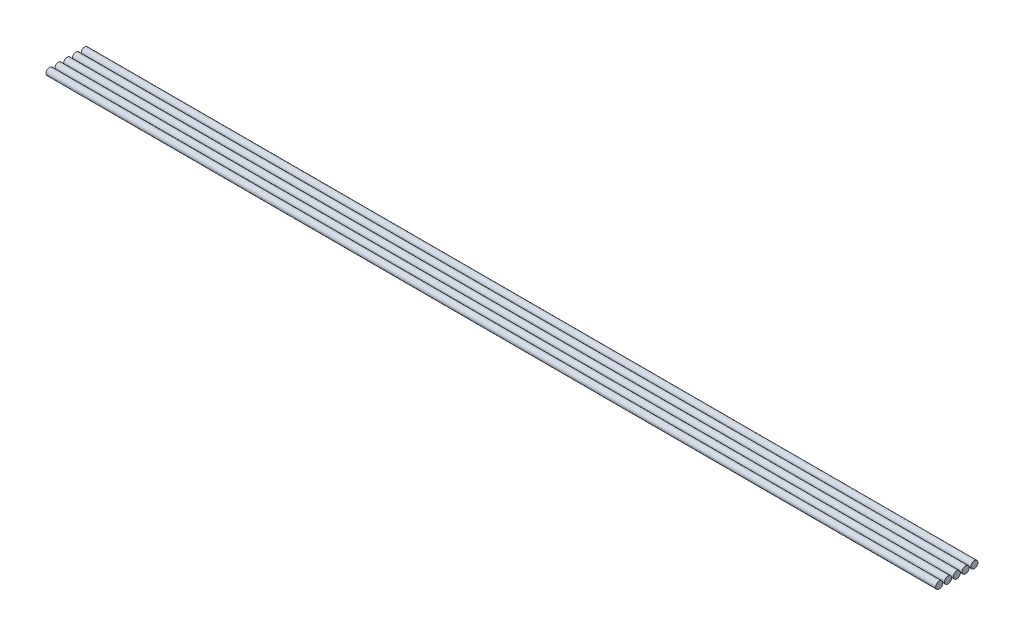
ISO-10303-21;
HEADER;
FILE_DESCRIPTION(('STEP AP214'),'2;1');
FILE_NAME('part.step','',(''),(''),'','','');
FILE_SCHEMA(('AUTOMOTIVE_DESIGN { 1 0 10303 214 1 1 1 1 }'));
ENDSEC;
DATA;
#1=APPLICATION_CONTEXT('core data for automotive mechanical design processes');
#2=APPLICATION_PROTOCOL_DEFINITION('international standard','automotive_design',2000,#1);
#3=PRODUCT_CONTEXT('',#1,'mechanical');
#4=PRODUCT('Part','Part','',(#3));
#5=PRODUCT_RELATED_PRODUCT_CATEGORY('part','',(#4));
#6=PRODUCT_DEFINITION_FORMATION('','',#4);
#7=PRODUCT_DEFINITION_CONTEXT('part definition',#1,'design');
#8=PRODUCT_DEFINITION('design','',#6,#7);
#9=PRODUCT_DEFINITION_SHAPE('','',#8);
#10=(LENGTH_UNIT() NAMED_UNIT(*) SI_UNIT(.MILLI.,.METRE.));
#11=(NAMED_UNIT(*) PLANE_ANGLE_UNIT() SI_UNIT($,.RADIAN.));
#12=(NAMED_UNIT(*) SI_UNIT($,.STERADIAN.) SOLID_ANGLE_UNIT());
#13=UNCERTAINTY_MEASURE_WITH_UNIT(LENGTH_MEASURE(1.E-05),#10,'distance_accuracy_value','');
#14=(GEOMETRIC_REPRESENTATION_CONTEXT(3) GLOBAL_UNCERTAINTY_ASSIGNED_CONTEXT((#13)) GLOBAL_UNIT_ASSIGNED_CONTEXT((#10,
#11,#12)) REPRESENTATION_CONTEXT('',''));
#15=CARTESIAN_POINT('',(0.,0.,0.));
#16=DIRECTION('',(0.,0.,1.));
#17=DIRECTION('',(1.,0.,0.));
#18=AXIS2_PLACEMENT_3D('',#15,#16,#17);
#19=CARTESIAN_POINT('',(0.,0.,2.));
#20=DIRECTION('',(1.,0.,0.));
#21=DIRECTION('',(0.,0.,-1.));
#22=AXIS2_PLACEMENT_3D('',#19,#20,#21);
#23=PLANE('',#22);
#24=CARTESIAN_POINT('',(0.,0.,2.));
#25=DIRECTION('',(1.,0.,0.));
#26=DIRECTION('',(0.,0.,-1.));
#27=AXIS2_PLACEMENT_3D('',#24,#25,#26);
#28=CIRCLE('',#27,0.4);
#29=CARTESIAN_POINT('',(0.,0.,1.6));
#30=VERTEX_POINT('',#29);
#31=EDGE_CURVE('E63',#30,#30,#28,.T.);
#32=ORIENTED_EDGE('',*,*,#31,.F.);
#33=EDGE_LOOP('',(#32));
#34=FACE_BOUND('',#33,.T.);
#35=ADVANCED_FACE('F56',(#34),#23,.F.);
#36=CARTESIAN_POINT('',(101.,0.,2.));
#37=DIRECTION('',(1.,0.,0.));
#38=DIRECTION('',(0.,0.,-1.));
#39=AXIS2_PLACEMENT_3D('',#36,#37,#38);
#40=PLANE('',#39);
#41=CARTESIAN_POINT('',(101.,0.,2.));
#42=DIRECTION('',(1.,0.,0.));
#43=DIRECTION('',(0.,0.,-1.));
#44=AXIS2_PLACEMENT_3D('',#41,#42,#43);
#45=CIRCLE('',#44,0.4);
#46=CARTESIAN_POINT('',(101.,0.,1.6));
#47=VERTEX_POINT('',#46);
#48=EDGE_CURVE('E14',#47,#47,#45,.T.);
#49=ORIENTED_EDGE('',*,*,#48,.T.);
#50=EDGE_LOOP('',(#49));
#51=FACE_BOUND('',#50,.T.);
#52=ADVANCED_FACE('F70',(#51),#40,.T.);
#53=CARTESIAN_POINT('',(0.,0.,2.));
#54=DIRECTION('',(1.,0.,0.));
#55=DIRECTION('',(0.,0.,-1.));
#56=AXIS2_PLACEMENT_3D('',#53,#54,#55);
#57=CYLINDRICAL_SURFACE('',#56,0.4);
#58=ORIENTED_EDGE('',*,*,#48,.F.);
#59=EDGE_LOOP('',(#58));
#60=FACE_BOUND('',#59,.T.);
#61=ORIENTED_EDGE('',*,*,#31,.T.);
#62=EDGE_LOOP('',(#61));
#63=FACE_BOUND('',#62,.T.);
#64=ADVANCED_FACE('F72',(#60,#63),#57,.T.);
#65=CLOSED_SHELL('',(#35,#52,#64));
#66=MANIFOLD_SOLID_BREP('B2',#65);
#67=CARTESIAN_POINT('',(0.,0.,1.));
#68=DIRECTION('',(1.,0.,0.));
#69=DIRECTION('',(0.,0.,-1.));
#70=AXIS2_PLACEMENT_3D('',#67,#68,#69);
#71=PLANE('',#70);
#72=CARTESIAN_POINT('',(0.,0.,1.));
#73=DIRECTION('',(1.,0.,0.));
#74=DIRECTION('',(0.,0.,-1.));
#75=AXIS2_PLACEMENT_3D('',#72,#73,#74);
#76=CIRCLE('',#75,0.4);
#77=CARTESIAN_POINT('',(0.,0.,0.6));
#78=VERTEX_POINT('',#77);
#79=EDGE_CURVE('E124',#78,#78,#76,.T.);
#80=ORIENTED_EDGE('',*,*,#79,.F.);
#81=EDGE_LOOP('',(#80));
#82=FACE_BOUND('',#81,.T.);
#83=ADVANCED_FACE('F117',(#82),#71,.F.);
#84=CARTESIAN_POINT('',(101.,0.,1.));
#85=DIRECTION('',(1.,0.,0.));
#86=DIRECTION('',(0.,0.,-1.));
#87=AXIS2_PLACEMENT_3D('',#84,#85,#86);
#88=PLANE('',#87);
#89=CARTESIAN_POINT('',(101.,0.,1.));
#90=DIRECTION('',(1.,0.,0.));
#91=DIRECTION('',(0.,0.,-1.));
#92=AXIS2_PLACEMENT_3D('',#89,#90,#91);
#93=CIRCLE('',#92,0.4);
#94=CARTESIAN_POINT('',(101.,0.,0.6));
#95=VERTEX_POINT('',#94);
#96=EDGE_CURVE('E54',#95,#95,#93,.T.);
#97=ORIENTED_EDGE('',*,*,#96,.T.);
#98=EDGE_LOOP('',(#97));
#99=FACE_BOUND('',#98,.T.);
#100=ADVANCED_FACE('F131',(#99),#88,.T.);
#101=CARTESIAN_POINT('',(0.,0.,1.));
#102=DIRECTION('',(1.,0.,0.));
#103=DIRECTION('',(0.,0.,-1.));
#104=AXIS2_PLACEMENT_3D('',#101,#102,#103);
#105=CYLINDRICAL_SURFACE('',#104,0.4);
#106=ORIENTED_EDGE('',*,*,#96,.F.);
#107=EDGE_LOOP('',(#106));
#108=FACE_BOUND('',#107,.T.);
#109=ORIENTED_EDGE('',*,*,#79,.T.);
#110=EDGE_LOOP('',(#109));
#111=FACE_BOUND('',#110,.T.);
#112=ADVANCED_FACE('F133',(#108,#111),#105,.T.);
#113=CLOSED_SHELL('',(#83,#100,#112));
#114=MANIFOLD_SOLID_BREP('B8',#113);
#115=CARTESIAN_POINT('',(0.,0.,0.));
#116=DIRECTION('',(1.,0.,0.));
#117=DIRECTION('',(0.,0.,-1.));
#118=AXIS2_PLACEMENT_3D('',#115,#116,#117);
#119=PLANE('',#118);
#120=CARTESIAN_POINT('',(0.,0.,0.));
#121=DIRECTION('',(1.,0.,0.));
#122=DIRECTION('',(0.,0.,-1.));
#123=AXIS2_PLACEMENT_3D('',#120,#121,#122);
#124=CIRCLE('',#123,0.4);
#125=CARTESIAN_POINT('',(0.,0.,-0.4));
#126=VERTEX_POINT('',#125);
#127=EDGE_CURVE('E185',#126,#126,#124,.T.);
#128=ORIENTED_EDGE('',*,*,#127,.F.);
#129=EDGE_LOOP('',(#128));
#130=FACE_BOUND('',#129,.T.);
#131=ADVANCED_FACE('F178',(#130),#119,.F.);
#132=CARTESIAN_POINT('',(101.,0.,0.));
#133=DIRECTION('',(1.,0.,0.));
#134=DIRECTION('',(0.,0.,-1.));
#135=AXIS2_PLACEMENT_3D('',#132,#133,#134);
#136=PLANE('',#135);
#137=CARTESIAN_POINT('',(101.,0.,0.));
#138=DIRECTION('',(1.,0.,0.));
#139=DIRECTION('',(0.,0.,-1.));
#140=AXIS2_PLACEMENT_3D('',#137,#138,#139);
#141=CIRCLE('',#140,0.4);
#142=CARTESIAN_POINT('',(101.,0.,-0.4));
#143=VERTEX_POINT('',#142);
#144=EDGE_CURVE('E115',#143,#143,#141,.T.);
#145=ORIENTED_EDGE('',*,*,#144,.T.);
#146=EDGE_LOOP('',(#145));
#147=FACE_BOUND('',#146,.T.);
#148=ADVANCED_FACE('F192',(#147),#136,.T.);
#149=CARTESIAN_POINT('',(0.,0.,0.));
#150=DIRECTION('',(1.,0.,0.));
#151=DIRECTION('',(0.,0.,-1.));
#152=AXIS2_PLACEMENT_3D('',#149,#150,#151);
#153=CYLINDRICAL_SURFACE('',#152,0.4);
#154=ORIENTED_EDGE('',*,*,#144,.F.);
#155=EDGE_LOOP('',(#154));
#156=FACE_BOUND('',#155,.T.);
#157=ORIENTED_EDGE('',*,*,#127,.T.);
#158=EDGE_LOOP('',(#157));
#159=FACE_BOUND('',#158,.T.);
#160=ADVANCED_FACE('F194',(#156,#159),#153,.T.);
#161=CLOSED_SHELL('',(#131,#148,#160));
#162=MANIFOLD_SOLID_BREP('B48',#161);
#163=CARTESIAN_POINT('',(0.,0.,-1.));
#164=DIRECTION('',(1.,0.,0.));
#165=DIRECTION('',(0.,0.,-1.));
#166=AXIS2_PLACEMENT_3D('',#163,#164,#165);
#167=PLANE('',#166);
#168=CARTESIAN_POINT('',(0.,0.,-1.));
#169=DIRECTION('',(1.,0.,0.));
#170=DIRECTION('',(0.,0.,-1.));
#171=AXIS2_PLACEMENT_3D('',#168,#169,#170);
#172=CIRCLE('',#171,0.4);
#173=CARTESIAN_POINT('',(0.,0.,-1.4));
#174=VERTEX_POINT('',#173);
#175=EDGE_CURVE('E245',#174,#174,#172,.T.);
#176=ORIENTED_EDGE('',*,*,#175,.F.);
#177=EDGE_LOOP('',(#176));
#178=FACE_BOUND('',#177,.T.);
#179=ADVANCED_FACE('F238',(#178),#167,.F.);
#180=CARTESIAN_POINT('',(101.,0.,-1.));
#181=DIRECTION('',(1.,0.,0.));
#182=DIRECTION('',(0.,0.,-1.));
#183=AXIS2_PLACEMENT_3D('',#180,#181,#182);
#184=PLANE('',#183);
#185=CARTESIAN_POINT('',(101.,0.,-1.));
#186=DIRECTION('',(1.,0.,0.));
#187=DIRECTION('',(0.,0.,-1.));
#188=AXIS2_PLACEMENT_3D('',#185,#186,#187);
#189=CIRCLE('',#188,0.4);
#190=CARTESIAN_POINT('',(101.,0.,-1.4));
#191=VERTEX_POINT('',#190);
#192=EDGE_CURVE('E176',#191,#191,#189,.T.);
#193=ORIENTED_EDGE('',*,*,#192,.T.);
#194=EDGE_LOOP('',(#193));
#195=FACE_BOUND('',#194,.T.);
#196=ADVANCED_FACE('F252',(#195),#184,.T.);
#197=CARTESIAN_POINT('',(0.,0.,-1.));
#198=DIRECTION('',(1.,0.,0.));
#199=DIRECTION('',(0.,0.,-1.));
#200=AXIS2_PLACEMENT_3D('',#197,#198,#199);
#201=CYLINDRICAL_SURFACE('',#200,0.4);
#202=ORIENTED_EDGE('',*,*,#192,.F.);
#203=EDGE_LOOP('',(#202));
#204=FACE_BOUND('',#203,.T.);
#205=ORIENTED_EDGE('',*,*,#175,.T.);
#206=EDGE_LOOP('',(#205));
#207=FACE_BOUND('',#206,.T.);
#208=ADVANCED_FACE('F254',(#204,#207),#201,.T.);
#209=CLOSED_SHELL('',(#179,#196,#208));
#210=MANIFOLD_SOLID_BREP('B109',#209);
#211=CARTESIAN_POINT('',(0.,0.,-2.));
#212=DIRECTION('',(1.,0.,0.));
#213=DIRECTION('',(0.,0.,-1.));
#214=AXIS2_PLACEMENT_3D('',#211,#212,#213);
#215=PLANE('',#214);
#216=CARTESIAN_POINT('',(0.,0.,-2.));
#217=DIRECTION('',(1.,0.,0.));
#218=DIRECTION('',(0.,0.,-1.));
#219=AXIS2_PLACEMENT_3D('',#216,#217,#218);
#220=CIRCLE('',#219,0.4);
#221=CARTESIAN_POINT('',(0.,0.,-2.4));
#222=VERTEX_POINT('',#221);
#223=EDGE_CURVE('E294',#222,#222,#220,.T.);
#224=ORIENTED_EDGE('',*,*,#223,.F.);
#225=EDGE_LOOP('',(#224));
#226=FACE_BOUND('',#225,.T.);
#227=ADVANCED_FACE('F287',(#226),#215,.F.);
#228=CARTESIAN_POINT('',(101.,0.,-2.));
#229=DIRECTION('',(1.,0.,0.));
#230=DIRECTION('',(0.,0.,-1.));
#231=AXIS2_PLACEMENT_3D('',#228,#229,#230);
#232=PLANE('',#231);
#233=CARTESIAN_POINT('',(101.,0.,-2.));
#234=DIRECTION('',(1.,0.,0.));
#235=DIRECTION('',(0.,0.,-1.));
#236=AXIS2_PLACEMENT_3D('',#233,#234,#235);
#237=CIRCLE('',#236,0.4);
#238=CARTESIAN_POINT('',(101.,0.,-2.4));
#239=VERTEX_POINT('',#238);
#240=EDGE_CURVE('E236',#239,#239,#237,.T.);
#241=ORIENTED_EDGE('',*,*,#240,.T.);
#242=EDGE_LOOP('',(#241));
#243=FACE_BOUND('',#242,.T.);
#244=ADVANCED_FACE('F301',(#243),#232,.T.);
#245=CARTESIAN_POINT('',(0.,0.,-2.));
#246=DIRECTION('',(1.,0.,0.));
#247=DIRECTION('',(0.,0.,-1.));
#248=AXIS2_PLACEMENT_3D('',#245,#246,#247);
#249=CYLINDRICAL_SURFACE('',#248,0.4);
#250=ORIENTED_EDGE('',*,*,#240,.F.);
#251=EDGE_LOOP('',(#250));
#252=FACE_BOUND('',#251,.T.);
#253=ORIENTED_EDGE('',*,*,#223,.T.);
#254=EDGE_LOOP('',(#253));
#255=FACE_BOUND('',#254,.T.);
#256=ADVANCED_FACE('F303',(#252,#255),#249,.T.);
#257=CLOSED_SHELL('',(#227,#244,#256));
#258=MANIFOLD_SOLID_BREP('B170',#257);
#259=ADVANCED_BREP_SHAPE_REPRESENTATION('',(#18,#66,#114,#162,#210,#258),#14);
#260=SHAPE_DEFINITION_REPRESENTATION(#9,#259);
ENDSEC;
END-ISO-10303-21;
